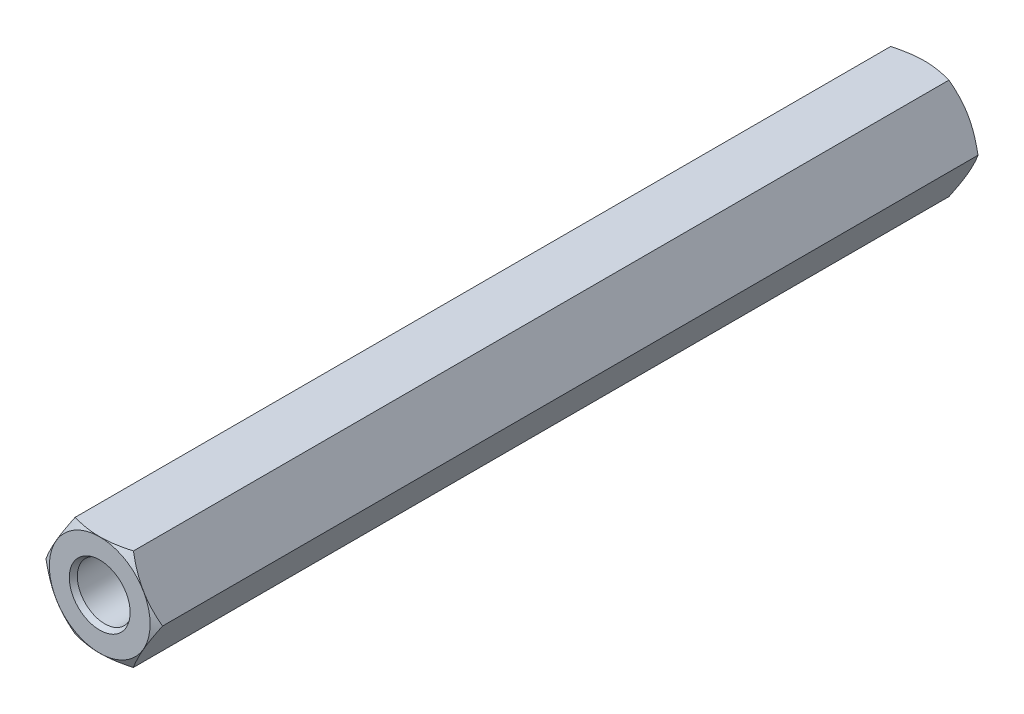
ISO-10303-21;
HEADER;
FILE_DESCRIPTION(('STEP AP214'),'2;1');
FILE_NAME('part.step','',(''),(''),'','','');
FILE_SCHEMA(('AUTOMOTIVE_DESIGN { 1 0 10303 214 1 1 1 1 }'));
ENDSEC;
DATA;
#1=APPLICATION_CONTEXT('core data for automotive mechanical design processes');
#2=APPLICATION_PROTOCOL_DEFINITION('international standard','automotive_design',2000,#1);
#3=PRODUCT_CONTEXT('',#1,'mechanical');
#4=PRODUCT('Part','Part','',(#3));
#5=PRODUCT_RELATED_PRODUCT_CATEGORY('part','',(#4));
#6=PRODUCT_DEFINITION_FORMATION('','',#4);
#7=PRODUCT_DEFINITION_CONTEXT('part definition',#1,'design');
#8=PRODUCT_DEFINITION('design','',#6,#7);
#9=PRODUCT_DEFINITION_SHAPE('','',#8);
#10=(LENGTH_UNIT() NAMED_UNIT(*) SI_UNIT(.MILLI.,.METRE.));
#11=(NAMED_UNIT(*) PLANE_ANGLE_UNIT() SI_UNIT($,.RADIAN.));
#12=(NAMED_UNIT(*) SI_UNIT($,.STERADIAN.) SOLID_ANGLE_UNIT());
#13=UNCERTAINTY_MEASURE_WITH_UNIT(LENGTH_MEASURE(1.E-05),#10,'distance_accuracy_value','');
#14=(GEOMETRIC_REPRESENTATION_CONTEXT(3) GLOBAL_UNCERTAINTY_ASSIGNED_CONTEXT((#13)) GLOBAL_UNIT_ASSIGNED_CONTEXT((#10,
#11,#12)) REPRESENTATION_CONTEXT('',''));
#15=CARTESIAN_POINT('',(0.,0.,0.));
#16=DIRECTION('',(0.,0.,1.));
#17=DIRECTION('',(1.,0.,0.));
#18=AXIS2_PLACEMENT_3D('',#15,#16,#17);
#19=CARTESIAN_POINT('',(0.,0.,9.866025403784));
#20=DIRECTION('',(0.,0.,-1.));
#21=DIRECTION('',(1.,0.,0.));
#22=AXIS2_PLACEMENT_3D('',#19,#20,#21);
#23=CONICAL_SURFACE('',#22,1.73205080757049,1.047197551197);
#24=DIRECTION('',(0.866025403784329,0.,-0.50000000000019));
#25=VECTOR('',#24,1.);
#26=CARTESIAN_POINT('',(0.,0.,10.866025403784));
#27=LINE('',#26,#25);
#28=CARTESIAN_POINT('',(0.,0.,10.866025403784));
#29=VERTEX_POINT('',#28);
#30=CARTESIAN_POINT('',(1.5,0.,10.));
#31=VERTEX_POINT('',#30);
#32=EDGE_CURVE('E10',#29,#31,#27,.T.);
#33=ORIENTED_EDGE('',*,*,#32,.T.);
#34=CARTESIAN_POINT('',(0.,0.,10.));
#35=DIRECTION('',(0.,0.,1.));
#36=DIRECTION('',(1.,0.,0.));
#37=AXIS2_PLACEMENT_3D('',#34,#35,#36);
#38=CIRCLE('',#37,1.5);
#39=EDGE_CURVE('E29',#31,#31,#38,.T.);
#40=ORIENTED_EDGE('',*,*,#39,.F.);
#41=ORIENTED_EDGE('',*,*,#32,.F.);
#42=EDGE_LOOP('',(#33,#40,#41));
#43=FACE_BOUND('',#42,.T.);
#44=ADVANCED_FACE('F18',(#43),#23,.F.);
#45=CARTESIAN_POINT('',(0.,0.,10.));
#46=DIRECTION('',(0.,0.,-1.));
#47=DIRECTION('',(1.,0.,0.));
#48=AXIS2_PLACEMENT_3D('',#45,#46,#47);
#49=CYLINDRICAL_SURFACE('',#48,1.5);
#50=ORIENTED_EDGE('',*,*,#39,.T.);
#51=DIRECTION('',(0.,0.,-1.));
#52=VECTOR('',#51,1.);
#53=CARTESIAN_POINT('',(1.5,0.,10.));
#54=LINE('',#53,#52);
#55=CARTESIAN_POINT('',(1.5,0.,0.277128129211));
#56=VERTEX_POINT('',#55);
#57=EDGE_CURVE('E243',#31,#56,#54,.T.);
#58=ORIENTED_EDGE('',*,*,#57,.T.);
#59=CARTESIAN_POINT('',(0.,0.,0.277128129211));
#60=DIRECTION('',(0.,0.,1.));
#61=DIRECTION('',(1.,0.,0.));
#62=AXIS2_PLACEMENT_3D('',#59,#60,#61);
#63=CIRCLE('',#62,1.5);
#64=EDGE_CURVE('E239',#56,#56,#63,.T.);
#65=ORIENTED_EDGE('',*,*,#64,.F.);
#66=ORIENTED_EDGE('',*,*,#57,.F.);
#67=EDGE_LOOP('',(#50,#58,#65,#66));
#68=FACE_BOUND('',#67,.T.);
#69=ADVANCED_FACE('F351',(#68),#49,.F.);
#70=CARTESIAN_POINT('',(0.,0.,0.277128129211));
#71=DIRECTION('',(0.,0.,-1.));
#72=DIRECTION('',(1.,0.,0.));
#73=AXIS2_PLACEMENT_3D('',#70,#71,#72);
#74=CONICAL_SURFACE('',#73,1.5,0.523598775598);
#75=ORIENTED_EDGE('',*,*,#64,.T.);
#76=DIRECTION('',(0.50000000000019,0.,-0.866025403784329));
#77=VECTOR('',#76,1.);
#78=CARTESIAN_POINT('',(1.5,0.,0.277128129211));
#79=LINE('',#78,#77);
#80=CARTESIAN_POINT('',(1.66,0.,0.));
#81=VERTEX_POINT('',#80);
#82=EDGE_CURVE('E244',#56,#81,#79,.T.);
#83=ORIENTED_EDGE('',*,*,#82,.T.);
#84=CARTESIAN_POINT('',(0.,0.,0.));
#85=DIRECTION('',(0.,0.,1.));
#86=DIRECTION('',(1.,0.,0.));
#87=AXIS2_PLACEMENT_3D('',#84,#85,#86);
#88=CIRCLE('',#87,1.66);
#89=EDGE_CURVE('E226',#81,#81,#88,.T.);
#90=ORIENTED_EDGE('',*,*,#89,.F.);
#91=ORIENTED_EDGE('',*,*,#82,.F.);
#92=EDGE_LOOP('',(#75,#83,#90,#91));
#93=FACE_BOUND('',#92,.T.);
#94=ADVANCED_FACE('F356',(#93),#74,.F.);
#95=CARTESIAN_POINT('',(0.,0.,0.));
#96=DIRECTION('',(0.,0.,1.));
#97=DIRECTION('',(1.,0.,0.));
#98=AXIS2_PLACEMENT_3D('',#95,#96,#97);
#99=PLANE('',#98);
#100=ORIENTED_EDGE('',*,*,#89,.T.);
#101=EDGE_LOOP('',(#100));
#102=FACE_BOUND('',#101,.T.);
#103=CARTESIAN_POINT('',(0.,0.,0.));
#104=DIRECTION('',(0.,0.,1.));
#105=DIRECTION('',(1.,0.,0.));
#106=AXIS2_PLACEMENT_3D('',#103,#104,#105);
#107=CIRCLE('',#106,2.75);
#108=CARTESIAN_POINT('',(2.75,0.,0.));
#109=VERTEX_POINT('',#108);
#110=EDGE_CURVE('E222',#109,#109,#107,.T.);
#111=ORIENTED_EDGE('',*,*,#110,.F.);
#112=EDGE_LOOP('',(#111));
#113=FACE_BOUND('',#112,.T.);
#114=ADVANCED_FACE('F346',(#102,#113),#99,.F.);
#115=CARTESIAN_POINT('',(0.,0.,0.));
#116=DIRECTION('',(0.,0.,1.));
#117=DIRECTION('',(1.,0.,0.));
#118=AXIS2_PLACEMENT_3D('',#115,#116,#117);
#119=CONICAL_SURFACE('',#118,2.75,1.047197551197);
#120=DIRECTION('',(0.866025403784329,0.,0.50000000000019));
#121=VECTOR('',#120,1.);
#122=CARTESIAN_POINT('',(2.75,0.,0.));
#123=LINE('',#122,#121);
#124=CARTESIAN_POINT('',(3.18,0.,0.248260615752));
#125=VERTEX_POINT('',#124);
#126=EDGE_CURVE('E227',#109,#125,#123,.T.);
#127=ORIENTED_EDGE('',*,*,#126,.F.);
#128=ORIENTED_EDGE('',*,*,#110,.T.);
#129=ORIENTED_EDGE('',*,*,#126,.T.);
#130=CARTESIAN_POINT('',(1.58999999999974,-2.75396078403401,0.248260615752079));
#131=CARTESIAN_POINT('',(2.38499999999996,-1.37698039201706,-0.210732848253774));
#132=CARTESIAN_POINT('',(3.18000000000017,-1.49213974509621E-13,0.248260615752026));
#133=(BOUNDED_CURVE() B_SPLINE_CURVE(2,(#130,#131,#132),.UNSPECIFIED.,.F.,
.F.) B_SPLINE_CURVE_WITH_KNOTS((3,3),(0.,1.),
.UNSPECIFIED.) CURVE() GEOMETRIC_REPRESENTATION_ITEM() RATIONAL_B_SPLINE_CURVE((1.,
1.15470053837928,1.)) REPRESENTATION_ITEM(''));
#134=CARTESIAN_POINT('',(1.59,-2.753960784034,0.248260615752));
#135=VERTEX_POINT('',#134);
#136=EDGE_CURVE('E245',#135,#125,#133,.T.);
#137=ORIENTED_EDGE('',*,*,#136,.F.);
#138=CARTESIAN_POINT('',(-1.58999999999975,-2.753960784035,0.248260615751858));
#139=CARTESIAN_POINT('',(1.22568621918617E-13,-2.75396078403501,-0.210732848253664));
#140=CARTESIAN_POINT('',(1.59000000000008,-2.753960784035,0.248260615751953));
#141=(BOUNDED_CURVE() B_SPLINE_CURVE(2,(#138,#139,#140),.UNSPECIFIED.,.F.,
.F.) B_SPLINE_CURVE_WITH_KNOTS((3,3),(0.,1.),
.UNSPECIFIED.) CURVE() GEOMETRIC_REPRESENTATION_ITEM() RATIONAL_B_SPLINE_CURVE((1.,
1.15470053837918,1.)) REPRESENTATION_ITEM(''));
#142=CARTESIAN_POINT('',(-1.59,-2.753960784035,0.248260615752));
#143=VERTEX_POINT('',#142);
#144=EDGE_CURVE('E201',#143,#135,#141,.T.);
#145=ORIENTED_EDGE('',*,*,#144,.F.);
#146=CARTESIAN_POINT('',(-3.18000000000019,-1.10578213252666E-13,0.248260615752039));
#147=CARTESIAN_POINT('',(-2.3849999999999,-1.37698039201718,-0.210732848253821));
#148=CARTESIAN_POINT('',(-1.58999999999955,-2.75396078403435,0.248260615752193));
#149=(BOUNDED_CURVE() B_SPLINE_CURVE(2,(#146,#147,#148),.UNSPECIFIED.,.F.,
.F.) B_SPLINE_CURVE_WITH_KNOTS((3,3),(0.,1.),
.UNSPECIFIED.) CURVE() GEOMETRIC_REPRESENTATION_ITEM() RATIONAL_B_SPLINE_CURVE((1.,
1.15470053837932,1.)) REPRESENTATION_ITEM(''));
#150=CARTESIAN_POINT('',(-3.18,0.,0.248260615752));
#151=VERTEX_POINT('',#150);
#152=EDGE_CURVE('E156',#151,#143,#149,.T.);
#153=ORIENTED_EDGE('',*,*,#152,.F.);
#154=CARTESIAN_POINT('',(-1.58999999999887,2.75396078403551,0.248260615752579));
#155=CARTESIAN_POINT('',(-2.38499999999965,1.37698039201761,-0.210732848253967));
#156=CARTESIAN_POINT('',(-3.18000000000019,1.0946799022804E-13,0.24826061575204));
#157=(BOUNDED_CURVE() B_SPLINE_CURVE(2,(#154,#155,#156),.UNSPECIFIED.,.F.,
.F.) B_SPLINE_CURVE_WITH_KNOTS((3,3),(0.,1.),
.UNSPECIFIED.) CURVE() GEOMETRIC_REPRESENTATION_ITEM() RATIONAL_B_SPLINE_CURVE((1.,
1.15470053837944,1.)) REPRESENTATION_ITEM(''));
#158=CARTESIAN_POINT('',(-1.59,2.753960784035,0.248260615752));
#159=VERTEX_POINT('',#158);
#160=EDGE_CURVE('E232',#159,#151,#157,.T.);
#161=ORIENTED_EDGE('',*,*,#160,.F.);
#162=CARTESIAN_POINT('',(1.58999999999975,2.753960784035,0.248260615751858));
#163=CARTESIAN_POINT('',(-1.22124532708767E-13,2.75396078403501,-0.210732848253664));
#164=CARTESIAN_POINT('',(-1.59000000000008,2.753960784035,0.248260615751953));
#165=(BOUNDED_CURVE() B_SPLINE_CURVE(2,(#162,#163,#164),.UNSPECIFIED.,.F.,
.F.) B_SPLINE_CURVE_WITH_KNOTS((3,3),(0.,1.),
.UNSPECIFIED.) CURVE() GEOMETRIC_REPRESENTATION_ITEM() RATIONAL_B_SPLINE_CURVE((1.,
1.15470053837918,1.)) REPRESENTATION_ITEM(''));
#166=CARTESIAN_POINT('',(1.59,2.753960784034,0.248260615752));
#167=VERTEX_POINT('',#166);
#168=EDGE_CURVE('E57',#167,#159,#165,.T.);
#169=ORIENTED_EDGE('',*,*,#168,.F.);
#170=CARTESIAN_POINT('',(3.18000000000026,0.,0.248260615752079));
#171=CARTESIAN_POINT('',(2.38500000000004,1.37698039201694,-0.210732848253774));
#172=CARTESIAN_POINT('',(1.58999999999983,2.75396078403385,0.248260615752026));
#173=(BOUNDED_CURVE() B_SPLINE_CURVE(2,(#170,#171,#172),.UNSPECIFIED.,.F.,
.F.) B_SPLINE_CURVE_WITH_KNOTS((3,3),(0.,1.),
.UNSPECIFIED.) CURVE() GEOMETRIC_REPRESENTATION_ITEM() RATIONAL_B_SPLINE_CURVE((1.,
1.15470053837928,1.)) REPRESENTATION_ITEM(''));
#174=EDGE_CURVE('E168',#125,#167,#173,.T.);
#175=ORIENTED_EDGE('',*,*,#174,.F.);
#176=EDGE_LOOP('',(#127,#128,#129,#137,#145,#153,#161,#169,#175));
#177=FACE_BOUND('',#176,.T.);
#178=ADVANCED_FACE('F338',(#177),#119,.T.);
#179=CARTESIAN_POINT('',(3.18,0.,0.));
#180=DIRECTION('',(-0.866025403784329,-0.50000000000019,0.));
#181=DIRECTION('',(-0.50000000000019,0.866025403784329,0.));
#182=AXIS2_PLACEMENT_3D('',#179,#180,#181);
#183=PLANE('',#182);
#184=DIRECTION('',(0.,0.,1.));
#185=VECTOR('',#184,1.);
#186=CARTESIAN_POINT('',(1.59,2.753960784035,0.));
#187=LINE('',#186,#185);
#188=CARTESIAN_POINT('',(1.59,2.753960784034,44.751739384248));
#189=VERTEX_POINT('',#188);
#190=EDGE_CURVE('E233',#167,#189,#187,.T.);
#191=ORIENTED_EDGE('',*,*,#190,.T.);
#192=CARTESIAN_POINT('',(1.58999999999974,2.753960784034,44.751739384248));
#193=CARTESIAN_POINT('',(2.38499999999997,1.37698039201706,45.2107328482538));
#194=CARTESIAN_POINT('',(3.18000000000016,1.51434420558871E-13,44.751739384248));
#195=(BOUNDED_CURVE() B_SPLINE_CURVE(2,(#192,#193,#194),.UNSPECIFIED.,.F.,
.F.) B_SPLINE_CURVE_WITH_KNOTS((3,3),(0.,1.),
.UNSPECIFIED.) CURVE() GEOMETRIC_REPRESENTATION_ITEM() RATIONAL_B_SPLINE_CURVE((1.,
1.15470053837922,1.)) REPRESENTATION_ITEM(''));
#196=CARTESIAN_POINT('',(3.18,0.,44.751739384248));
#197=VERTEX_POINT('',#196);
#198=EDGE_CURVE('E71',#189,#197,#195,.T.);
#199=ORIENTED_EDGE('',*,*,#198,.T.);
#200=DIRECTION('',(0.,0.,1.));
#201=VECTOR('',#200,1.);
#202=CARTESIAN_POINT('',(3.18,0.,0.248260615752));
#203=LINE('',#202,#201);
#204=EDGE_CURVE('E195',#125,#197,#203,.T.);
#205=ORIENTED_EDGE('',*,*,#204,.F.);
#206=ORIENTED_EDGE('',*,*,#174,.T.);
#207=EDGE_LOOP('',(#191,#199,#205,#206));
#208=FACE_BOUND('',#207,.T.);
#209=ADVANCED_FACE('F335',(#208),#183,.F.);
#210=CARTESIAN_POINT('',(1.59,2.753960784035,0.));
#211=DIRECTION('',(0.,-1.,0.));
#212=DIRECTION('',(-1.,0.,0.));
#213=AXIS2_PLACEMENT_3D('',#210,#211,#212);
#214=PLANE('',#213);
#215=DIRECTION('',(0.,0.,1.));
#216=VECTOR('',#215,1.);
#217=CARTESIAN_POINT('',(-1.59,2.753960784035,0.));
#218=LINE('',#217,#216);
#219=CARTESIAN_POINT('',(-1.59,2.753960784035,44.751739384248));
#220=VERTEX_POINT('',#219);
#221=EDGE_CURVE('E162',#159,#220,#218,.T.);
#222=ORIENTED_EDGE('',*,*,#221,.T.);
#223=CARTESIAN_POINT('',(-1.58999999999974,2.753960784035,44.7517393842482));
#224=CARTESIAN_POINT('',(1.25011112572792E-13,2.753960784035,45.2107328482536));
#225=CARTESIAN_POINT('',(1.59000000000009,2.753960784035,44.7517393842481));
#226=(BOUNDED_CURVE() B_SPLINE_CURVE(2,(#223,#224,#225),.UNSPECIFIED.,.F.,
.F.) B_SPLINE_CURVE_WITH_KNOTS((3,3),(0.,1.),
.UNSPECIFIED.) CURVE() GEOMETRIC_REPRESENTATION_ITEM() RATIONAL_B_SPLINE_CURVE((1.,
1.15470053837915,1.)) REPRESENTATION_ITEM(''));
#227=EDGE_CURVE('E169',#220,#189,#226,.T.);
#228=ORIENTED_EDGE('',*,*,#227,.T.);
#229=ORIENTED_EDGE('',*,*,#190,.F.);
#230=ORIENTED_EDGE('',*,*,#168,.T.);
#231=EDGE_LOOP('',(#222,#228,#229,#230));
#232=FACE_BOUND('',#231,.T.);
#233=ADVANCED_FACE('F337',(#232),#214,.F.);
#234=CARTESIAN_POINT('',(-1.59,2.753960784035,0.));
#235=DIRECTION('',(0.866025403784329,-0.50000000000019,0.));
#236=DIRECTION('',(0.,0.,-1.));
#237=AXIS2_PLACEMENT_3D('',#234,#235,#236);
#238=PLANE('',#237);
#239=DIRECTION('',(0.,0.,1.));
#240=VECTOR('',#239,1.);
#241=CARTESIAN_POINT('',(-3.18,0.,0.));
#242=LINE('',#241,#240);
#243=CARTESIAN_POINT('',(-3.18,0.,44.751739384248));
#244=VERTEX_POINT('',#243);
#245=EDGE_CURVE('E182',#151,#244,#242,.T.);
#246=ORIENTED_EDGE('',*,*,#245,.T.);
#247=CARTESIAN_POINT('',(-3.18000000000032,-1.17905685215192E-13,44.7517393842479));
#248=CARTESIAN_POINT('',(-2.38499999999995,1.37698039201709,45.2107328482539));
#249=CARTESIAN_POINT('',(-1.58999999999954,2.75396078403435,44.7517393842478));
#250=(BOUNDED_CURVE() B_SPLINE_CURVE(2,(#247,#248,#249),.UNSPECIFIED.,.F.,
.F.) B_SPLINE_CURVE_WITH_KNOTS((3,3),(0.,1.),
.UNSPECIFIED.) CURVE() GEOMETRIC_REPRESENTATION_ITEM() RATIONAL_B_SPLINE_CURVE((1.,
1.15470053837933,1.)) REPRESENTATION_ITEM(''));
#251=EDGE_CURVE('E91',#244,#220,#250,.T.);
#252=ORIENTED_EDGE('',*,*,#251,.T.);
#253=ORIENTED_EDGE('',*,*,#221,.F.);
#254=ORIENTED_EDGE('',*,*,#160,.T.);
#255=EDGE_LOOP('',(#246,#252,#253,#254));
#256=FACE_BOUND('',#255,.T.);
#257=ADVANCED_FACE('F345',(#256),#238,.F.);
#258=CARTESIAN_POINT('',(-3.18,0.,0.));
#259=DIRECTION('',(0.866025403784329,0.50000000000019,0.));
#260=DIRECTION('',(0.,0.,-1.));
#261=AXIS2_PLACEMENT_3D('',#258,#259,#260);
#262=PLANE('',#261);
#263=DIRECTION('',(0.,0.,1.));
#264=VECTOR('',#263,1.);
#265=CARTESIAN_POINT('',(-1.59,-2.753960784035,0.));
#266=LINE('',#265,#264);
#267=CARTESIAN_POINT('',(-1.59,-2.753960784035,44.751739384248));
#268=VERTEX_POINT('',#267);
#269=EDGE_CURVE('E207',#143,#268,#266,.T.);
#270=ORIENTED_EDGE('',*,*,#269,.T.);
#271=CARTESIAN_POINT('',(-1.58999999999888,-2.7539607840355,44.7517393842475));
#272=CARTESIAN_POINT('',(-2.38499999999964,-1.37698039201763,45.210732848254));
#273=CARTESIAN_POINT('',(-3.18000000000014,-1.85851334322251E-13,44.751739384248));
#274=(BOUNDED_CURVE() B_SPLINE_CURVE(2,(#271,#272,#273),.UNSPECIFIED.,.F.,
.F.) B_SPLINE_CURVE_WITH_KNOTS((3,3),(0.,1.),
.UNSPECIFIED.) CURVE() GEOMETRIC_REPRESENTATION_ITEM() RATIONAL_B_SPLINE_CURVE((1.,
1.15470053837942,1.)) REPRESENTATION_ITEM(''));
#275=EDGE_CURVE('E103',#268,#244,#274,.T.);
#276=ORIENTED_EDGE('',*,*,#275,.T.);
#277=ORIENTED_EDGE('',*,*,#245,.F.);
#278=ORIENTED_EDGE('',*,*,#152,.T.);
#279=EDGE_LOOP('',(#270,#276,#277,#278));
#280=FACE_BOUND('',#279,.T.);
#281=ADVANCED_FACE('F366',(#280),#262,.F.);
#282=CARTESIAN_POINT('',(-1.59,-2.753960784035,0.));
#283=DIRECTION('',(0.,1.,0.));
#284=DIRECTION('',(1.,0.,0.));
#285=AXIS2_PLACEMENT_3D('',#282,#283,#284);
#286=PLANE('',#285);
#287=DIRECTION('',(0.,0.,1.));
#288=VECTOR('',#287,1.);
#289=CARTESIAN_POINT('',(1.59,-2.753960784035,0.));
#290=LINE('',#289,#288);
#291=CARTESIAN_POINT('',(1.59,-2.753960784034,44.751739384248));
#292=VERTEX_POINT('',#291);
#293=EDGE_CURVE('E161',#135,#292,#290,.T.);
#294=ORIENTED_EDGE('',*,*,#293,.T.);
#295=CARTESIAN_POINT('',(1.58999999999974,-2.753960784035,44.7517393842482));
#296=CARTESIAN_POINT('',(-1.24344978758018E-13,-2.753960784035,45.2107328482536));
#297=CARTESIAN_POINT('',(-1.59000000000009,-2.753960784035,44.7517393842481));
#298=(BOUNDED_CURVE() B_SPLINE_CURVE(2,(#295,#296,#297),.UNSPECIFIED.,.F.,
.F.) B_SPLINE_CURVE_WITH_KNOTS((3,3),(0.,1.),
.UNSPECIFIED.) CURVE() GEOMETRIC_REPRESENTATION_ITEM() RATIONAL_B_SPLINE_CURVE((1.,
1.15470053837915,1.)) REPRESENTATION_ITEM(''));
#299=EDGE_CURVE('E208',#292,#268,#298,.T.);
#300=ORIENTED_EDGE('',*,*,#299,.T.);
#301=ORIENTED_EDGE('',*,*,#269,.F.);
#302=ORIENTED_EDGE('',*,*,#144,.T.);
#303=EDGE_LOOP('',(#294,#300,#301,#302));
#304=FACE_BOUND('',#303,.T.);
#305=ADVANCED_FACE('F363',(#304),#286,.F.);
#306=CARTESIAN_POINT('',(1.59,-2.753960784035,0.));
#307=DIRECTION('',(-0.866025403784329,0.50000000000019,0.));
#308=DIRECTION('',(0.,0.,1.));
#309=AXIS2_PLACEMENT_3D('',#306,#307,#308);
#310=PLANE('',#309);
#311=ORIENTED_EDGE('',*,*,#204,.T.);
#312=CARTESIAN_POINT('',(3.18000000000026,0.,44.7517393842479));
#313=CARTESIAN_POINT('',(2.38500000000003,-1.37698039201695,45.2107328482538));
#314=CARTESIAN_POINT('',(1.58999999999983,-2.75396078403385,44.751739384248));
#315=(BOUNDED_CURVE() B_SPLINE_CURVE(2,(#312,#313,#314),.UNSPECIFIED.,.F.,
.F.) B_SPLINE_CURVE_WITH_KNOTS((3,3),(0.,1.),
.UNSPECIFIED.) CURVE() GEOMETRIC_REPRESENTATION_ITEM() RATIONAL_B_SPLINE_CURVE((1.,
1.15470053837923,1.)) REPRESENTATION_ITEM(''));
#316=EDGE_CURVE('E202',#197,#292,#315,.T.);
#317=ORIENTED_EDGE('',*,*,#316,.T.);
#318=ORIENTED_EDGE('',*,*,#293,.F.);
#319=ORIENTED_EDGE('',*,*,#136,.T.);
#320=EDGE_LOOP('',(#311,#317,#318,#319));
#321=FACE_BOUND('',#320,.T.);
#322=ADVANCED_FACE('F334',(#321),#310,.F.);
#323=CARTESIAN_POINT('',(0.,0.,44.751739384248));
#324=DIRECTION('',(0.,0.,-1.));
#325=DIRECTION('',(1.,0.,0.));
#326=AXIS2_PLACEMENT_3D('',#323,#324,#325);
#327=CONICAL_SURFACE('',#326,3.18,1.047197551197);
#328=ORIENTED_EDGE('',*,*,#316,.F.);
#329=DIRECTION('',(-0.866025403784329,0.,0.50000000000019));
#330=VECTOR('',#329,1.);
#331=CARTESIAN_POINT('',(3.18,0.,44.751739384248));
#332=LINE('',#331,#330);
#333=CARTESIAN_POINT('',(2.75,0.,45.));
#334=VERTEX_POINT('',#333);
#335=EDGE_CURVE('E22',#197,#334,#332,.T.);
#336=ORIENTED_EDGE('',*,*,#335,.T.);
#337=CARTESIAN_POINT('',(0.,0.,45.));
#338=DIRECTION('',(0.,0.,1.));
#339=DIRECTION('',(1.,0.,0.));
#340=AXIS2_PLACEMENT_3D('',#337,#338,#339);
#341=CIRCLE('',#340,2.75);
#342=EDGE_CURVE('E312',#334,#334,#341,.T.);
#343=ORIENTED_EDGE('',*,*,#342,.F.);
#344=ORIENTED_EDGE('',*,*,#335,.F.);
#345=ORIENTED_EDGE('',*,*,#198,.F.);
#346=ORIENTED_EDGE('',*,*,#227,.F.);
#347=ORIENTED_EDGE('',*,*,#251,.F.);
#348=ORIENTED_EDGE('',*,*,#275,.F.);
#349=ORIENTED_EDGE('',*,*,#299,.F.);
#350=EDGE_LOOP('',(#328,#336,#343,#344,#345,#346,#347,#348,#349));
#351=FACE_BOUND('',#350,.T.);
#352=ADVANCED_FACE('F330',(#351),#327,.T.);
#353=CARTESIAN_POINT('',(0.,0.,45.));
#354=DIRECTION('',(0.,0.,1.));
#355=DIRECTION('',(1.,0.,0.));
#356=AXIS2_PLACEMENT_3D('',#353,#354,#355);
#357=PLANE('',#356);
#358=ORIENTED_EDGE('',*,*,#342,.T.);
#359=EDGE_LOOP('',(#358));
#360=FACE_BOUND('',#359,.T.);
#361=CARTESIAN_POINT('',(0.,0.,45.));
#362=DIRECTION('',(0.,0.,1.));
#363=DIRECTION('',(1.,0.,0.));
#364=AXIS2_PLACEMENT_3D('',#361,#362,#363);
#365=CIRCLE('',#364,1.66);
#366=CARTESIAN_POINT('',(1.66,0.,45.));
#367=VERTEX_POINT('',#366);
#368=EDGE_CURVE('E308',#367,#367,#365,.T.);
#369=ORIENTED_EDGE('',*,*,#368,.F.);
#370=EDGE_LOOP('',(#369));
#371=FACE_BOUND('',#370,.T.);
#372=ADVANCED_FACE('F370',(#360,#371),#357,.T.);
#373=CARTESIAN_POINT('',(0.,0.,45.));
#374=DIRECTION('',(0.,0.,1.));
#375=DIRECTION('',(1.,0.,0.));
#376=AXIS2_PLACEMENT_3D('',#373,#374,#375);
#377=CONICAL_SURFACE('',#376,1.66,0.523598775598);
#378=ORIENTED_EDGE('',*,*,#368,.T.);
#379=DIRECTION('',(-0.50000000000019,0.,-0.866025403784329));
#380=VECTOR('',#379,1.);
#381=CARTESIAN_POINT('',(1.66,0.,45.));
#382=LINE('',#381,#380);
#383=CARTESIAN_POINT('',(1.5,0.,44.722871870789));
#384=VERTEX_POINT('',#383);
#385=EDGE_CURVE('E313',#367,#384,#382,.T.);
#386=ORIENTED_EDGE('',*,*,#385,.T.);
#387=CARTESIAN_POINT('',(0.,0.,44.722871870789));
#388=DIRECTION('',(0.,0.,1.));
#389=DIRECTION('',(1.,0.,0.));
#390=AXIS2_PLACEMENT_3D('',#387,#388,#389);
#391=CIRCLE('',#390,1.5);
#392=EDGE_CURVE('E154',#384,#384,#391,.T.);
#393=ORIENTED_EDGE('',*,*,#392,.F.);
#394=ORIENTED_EDGE('',*,*,#385,.F.);
#395=EDGE_LOOP('',(#378,#386,#393,#394));
#396=FACE_BOUND('',#395,.T.);
#397=ADVANCED_FACE('F20',(#396),#377,.F.);
#398=CARTESIAN_POINT('',(0.,0.,44.722871870789));
#399=DIRECTION('',(0.,0.,-1.));
#400=DIRECTION('',(1.,0.,0.));
#401=AXIS2_PLACEMENT_3D('',#398,#399,#400);
#402=CYLINDRICAL_SURFACE('',#401,1.5);
#403=ORIENTED_EDGE('',*,*,#392,.T.);
#404=DIRECTION('',(0.,0.,-1.));
#405=VECTOR('',#404,1.);
#406=CARTESIAN_POINT('',(1.5,0.,44.722871870789));
#407=LINE('',#406,#405);
#408=CARTESIAN_POINT('',(1.5,0.,35.));
#409=VERTEX_POINT('',#408);
#410=EDGE_CURVE('E150',#384,#409,#407,.T.);
#411=ORIENTED_EDGE('',*,*,#410,.T.);
#412=CARTESIAN_POINT('',(0.,0.,35.));
#413=DIRECTION('',(0.,0.,1.));
#414=DIRECTION('',(1.,0.,0.));
#415=AXIS2_PLACEMENT_3D('',#412,#413,#414);
#416=CIRCLE('',#415,1.5);
#417=EDGE_CURVE('E142',#409,#409,#416,.T.);
#418=ORIENTED_EDGE('',*,*,#417,.F.);
#419=ORIENTED_EDGE('',*,*,#410,.F.);
#420=EDGE_LOOP('',(#403,#411,#418,#419));
#421=FACE_BOUND('',#420,.T.);
#422=ADVANCED_FACE('F375',(#421),#402,.F.);
#423=CARTESIAN_POINT('',(0.,0.,35.));
#424=DIRECTION('',(0.,0.,1.));
#425=DIRECTION('',(1.,0.,0.));
#426=AXIS2_PLACEMENT_3D('',#423,#424,#425);
#427=CONICAL_SURFACE('',#426,1.5,1.047197551197);
#428=ORIENTED_EDGE('',*,*,#417,.T.);
#429=DIRECTION('',(-0.866025403784329,0.,-0.50000000000019));
#430=VECTOR('',#429,1.);
#431=CARTESIAN_POINT('',(1.5,0.,35.));
#432=LINE('',#431,#430);
#433=CARTESIAN_POINT('',(0.,0.,34.133974596216));
#434=VERTEX_POINT('',#433);
#435=EDGE_CURVE('E140',#409,#434,#432,.T.);
#436=ORIENTED_EDGE('',*,*,#435,.T.);
#437=ORIENTED_EDGE('',*,*,#435,.F.);
#438=EDGE_LOOP('',(#428,#436,#437));
#439=FACE_BOUND('',#438,.T.);
#440=ADVANCED_FACE('F141',(#439),#427,.F.);
#441=CLOSED_SHELL('',(#44,#69,#94,#114,#178,#209,#233,#257,#281,#305,#322,#352,#372,#397,#422,#440));
#442=MANIFOLD_SOLID_BREP('B1',#441);
#443=ADVANCED_BREP_SHAPE_REPRESENTATION('',(#18,#442),#14);
#444=SHAPE_DEFINITION_REPRESENTATION(#9,#443);
ENDSEC;
END-ISO-10303-21;
